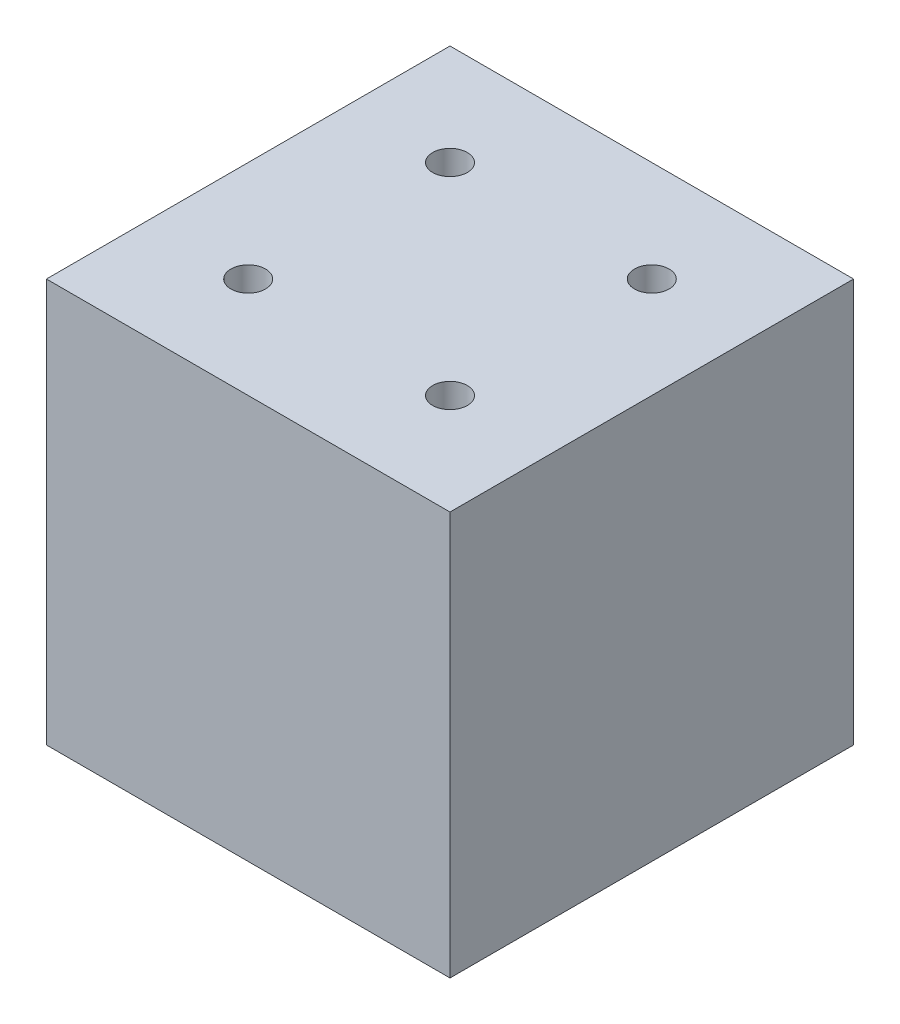
ISO-10303-21;
HEADER;
FILE_DESCRIPTION(('STEP AP214'),'2;1');
FILE_NAME('part.step','',(''),(''),'','','');
FILE_SCHEMA(('AUTOMOTIVE_DESIGN { 1 0 10303 214 1 1 1 1 }'));
ENDSEC;
DATA;
#1=APPLICATION_CONTEXT('core data for automotive mechanical design processes');
#2=APPLICATION_PROTOCOL_DEFINITION('international standard','automotive_design',2000,#1);
#3=PRODUCT_CONTEXT('',#1,'mechanical');
#4=PRODUCT('Part','Part','',(#3));
#5=PRODUCT_RELATED_PRODUCT_CATEGORY('part','',(#4));
#6=PRODUCT_DEFINITION_FORMATION('','',#4);
#7=PRODUCT_DEFINITION_CONTEXT('part definition',#1,'design');
#8=PRODUCT_DEFINITION('design','',#6,#7);
#9=PRODUCT_DEFINITION_SHAPE('','',#8);
#10=(LENGTH_UNIT() NAMED_UNIT(*) SI_UNIT(.MILLI.,.METRE.));
#11=(NAMED_UNIT(*) PLANE_ANGLE_UNIT() SI_UNIT($,.RADIAN.));
#12=(NAMED_UNIT(*) SI_UNIT($,.STERADIAN.) SOLID_ANGLE_UNIT());
#13=UNCERTAINTY_MEASURE_WITH_UNIT(LENGTH_MEASURE(1.E-05),#10,'distance_accuracy_value','');
#14=(GEOMETRIC_REPRESENTATION_CONTEXT(3) GLOBAL_UNCERTAINTY_ASSIGNED_CONTEXT((#13)) GLOBAL_UNIT_ASSIGNED_CONTEXT((#10,
#11,#12)) REPRESENTATION_CONTEXT('',''));
#15=CARTESIAN_POINT('',(0.,0.,0.));
#16=DIRECTION('',(0.,0.,1.));
#17=DIRECTION('',(1.,0.,0.));
#18=AXIS2_PLACEMENT_3D('',#15,#16,#17);
#19=CARTESIAN_POINT('',(25.4,50.8,25.4));
#20=DIRECTION('',(-1.,0.,0.));
#21=DIRECTION('',(0.,0.,1.));
#22=AXIS2_PLACEMENT_3D('',#19,#20,#21);
#23=PLANE('',#22);
#24=DIRECTION('',(0.,0.,-1.));
#25=VECTOR('',#24,1.);
#26=CARTESIAN_POINT('',(25.4,0.,25.4));
#27=LINE('',#26,#25);
#28=CARTESIAN_POINT('',(25.4,0.,25.4));
#29=VERTEX_POINT('',#28);
#30=CARTESIAN_POINT('',(25.4,0.,-25.4));
#31=VERTEX_POINT('',#30);
#32=EDGE_CURVE('E96',#29,#31,#27,.T.);
#33=ORIENTED_EDGE('',*,*,#32,.T.);
#34=DIRECTION('',(0.,-1.,0.));
#35=VECTOR('',#34,1.);
#36=CARTESIAN_POINT('',(25.4,50.8,-25.4));
#37=LINE('',#36,#35);
#38=CARTESIAN_POINT('',(25.4,50.8,-25.4));
#39=VERTEX_POINT('',#38);
#40=EDGE_CURVE('E11',#39,#31,#37,.T.);
#41=ORIENTED_EDGE('',*,*,#40,.F.);
#42=DIRECTION('',(0.,0.,-1.));
#43=VECTOR('',#42,1.);
#44=CARTESIAN_POINT('',(25.4,50.8,25.4));
#45=LINE('',#44,#43);
#46=CARTESIAN_POINT('',(25.4,50.8,25.4));
#47=VERTEX_POINT('',#46);
#48=EDGE_CURVE('E84',#47,#39,#45,.T.);
#49=ORIENTED_EDGE('',*,*,#48,.F.);
#50=DIRECTION('',(0.,-1.,0.));
#51=VECTOR('',#50,1.);
#52=CARTESIAN_POINT('',(25.4,50.8,25.4));
#53=LINE('',#52,#51);
#54=EDGE_CURVE('E92',#47,#29,#53,.T.);
#55=ORIENTED_EDGE('',*,*,#54,.T.);
#56=EDGE_LOOP('',(#33,#41,#49,#55));
#57=FACE_BOUND('',#56,.T.);
#58=ADVANCED_FACE('F33',(#57),#23,.F.);
#59=CARTESIAN_POINT('',(-25.4,50.8,-25.4));
#60=DIRECTION('',(0.,0.,1.));
#61=DIRECTION('',(1.,0.,0.));
#62=AXIS2_PLACEMENT_3D('',#59,#60,#61);
#63=PLANE('',#62);
#64=DIRECTION('',(-1.,0.,0.));
#65=VECTOR('',#64,1.);
#66=CARTESIAN_POINT('',(-25.4,0.,-25.4));
#67=LINE('',#66,#65);
#68=CARTESIAN_POINT('',(-25.4,0.,-25.4));
#69=VERTEX_POINT('',#68);
#70=EDGE_CURVE('E88',#31,#69,#67,.T.);
#71=ORIENTED_EDGE('',*,*,#70,.T.);
#72=DIRECTION('',(0.,-1.,0.));
#73=VECTOR('',#72,1.);
#74=CARTESIAN_POINT('',(-25.4,50.8,-25.4));
#75=LINE('',#74,#73);
#76=CARTESIAN_POINT('',(-25.4,50.8,-25.4));
#77=VERTEX_POINT('',#76);
#78=EDGE_CURVE('E41',#77,#69,#75,.T.);
#79=ORIENTED_EDGE('',*,*,#78,.F.);
#80=DIRECTION('',(-1.,0.,0.));
#81=VECTOR('',#80,1.);
#82=CARTESIAN_POINT('',(-25.4,50.8,-25.4));
#83=LINE('',#82,#81);
#84=EDGE_CURVE('E79',#39,#77,#83,.T.);
#85=ORIENTED_EDGE('',*,*,#84,.F.);
#86=ORIENTED_EDGE('',*,*,#40,.T.);
#87=EDGE_LOOP('',(#71,#79,#85,#86));
#88=FACE_BOUND('',#87,.T.);
#89=ADVANCED_FACE('F87',(#88),#63,.F.);
#90=CARTESIAN_POINT('',(-25.4,50.8,25.4));
#91=DIRECTION('',(1.,0.,0.));
#92=DIRECTION('',(0.,0.,-1.));
#93=AXIS2_PLACEMENT_3D('',#90,#91,#92);
#94=PLANE('',#93);
#95=DIRECTION('',(0.,0.,1.));
#96=VECTOR('',#95,1.);
#97=CARTESIAN_POINT('',(-25.4,0.,25.4));
#98=LINE('',#97,#96);
#99=CARTESIAN_POINT('',(-25.4,0.,25.4));
#100=VERTEX_POINT('',#99);
#101=EDGE_CURVE('E66',#69,#100,#98,.T.);
#102=ORIENTED_EDGE('',*,*,#101,.T.);
#103=DIRECTION('',(0.,-1.,0.));
#104=VECTOR('',#103,1.);
#105=CARTESIAN_POINT('',(-25.4,50.8,25.4));
#106=LINE('',#105,#104);
#107=CARTESIAN_POINT('',(-25.4,50.8,25.4));
#108=VERTEX_POINT('',#107);
#109=EDGE_CURVE('E89',#108,#100,#106,.T.);
#110=ORIENTED_EDGE('',*,*,#109,.F.);
#111=DIRECTION('',(0.,0.,1.));
#112=VECTOR('',#111,1.);
#113=CARTESIAN_POINT('',(-25.4,50.8,25.4));
#114=LINE('',#113,#112);
#115=EDGE_CURVE('E82',#77,#108,#114,.T.);
#116=ORIENTED_EDGE('',*,*,#115,.F.);
#117=ORIENTED_EDGE('',*,*,#78,.T.);
#118=EDGE_LOOP('',(#102,#110,#116,#117));
#119=FACE_BOUND('',#118,.T.);
#120=ADVANCED_FACE('F90',(#119),#94,.F.);
#121=CARTESIAN_POINT('',(-25.4,50.8,25.4));
#122=DIRECTION('',(0.,0.,-1.));
#123=DIRECTION('',(-1.,0.,0.));
#124=AXIS2_PLACEMENT_3D('',#121,#122,#123);
#125=PLANE('',#124);
#126=DIRECTION('',(1.,0.,0.));
#127=VECTOR('',#126,1.);
#128=CARTESIAN_POINT('',(-25.4,0.,25.4));
#129=LINE('',#128,#127);
#130=EDGE_CURVE('E72',#100,#29,#129,.T.);
#131=ORIENTED_EDGE('',*,*,#130,.T.);
#132=ORIENTED_EDGE('',*,*,#54,.F.);
#133=DIRECTION('',(1.,0.,0.));
#134=VECTOR('',#133,1.);
#135=CARTESIAN_POINT('',(-25.4,50.8,25.4));
#136=LINE('',#135,#134);
#137=EDGE_CURVE('E49',#108,#47,#136,.T.);
#138=ORIENTED_EDGE('',*,*,#137,.F.);
#139=ORIENTED_EDGE('',*,*,#109,.T.);
#140=EDGE_LOOP('',(#131,#132,#138,#139));
#141=FACE_BOUND('',#140,.T.);
#142=ADVANCED_FACE('F104',(#141),#125,.F.);
#143=CARTESIAN_POINT('',(0.,50.8,0.));
#144=DIRECTION('',(0.,-1.,0.));
#145=DIRECTION('',(0.,0.,-1.));
#146=AXIS2_PLACEMENT_3D('',#143,#144,#145);
#147=PLANE('',#146);
#148=CARTESIAN_POINT('',(-12.7,50.8,12.7));
#149=DIRECTION('',(0.,1.,0.));
#150=DIRECTION('',(0.,0.,1.));
#151=AXIS2_PLACEMENT_3D('',#148,#149,#150);
#152=CIRCLE('',#151,2.1828125);
#153=CARTESIAN_POINT('',(-12.7,50.8,14.8828125));
#154=VERTEX_POINT('',#153);
#155=EDGE_CURVE('E128',#154,#154,#152,.T.);
#156=ORIENTED_EDGE('',*,*,#155,.F.);
#157=EDGE_LOOP('',(#156));
#158=FACE_BOUND('',#157,.T.);
#159=CARTESIAN_POINT('',(12.7,50.8,12.7));
#160=DIRECTION('',(0.,1.,0.));
#161=DIRECTION('',(0.,0.,1.));
#162=AXIS2_PLACEMENT_3D('',#159,#160,#161);
#163=CIRCLE('',#162,2.1828125);
#164=CARTESIAN_POINT('',(12.7,50.8,14.8828125));
#165=VERTEX_POINT('',#164);
#166=EDGE_CURVE('E122',#165,#165,#163,.T.);
#167=ORIENTED_EDGE('',*,*,#166,.F.);
#168=EDGE_LOOP('',(#167));
#169=FACE_BOUND('',#168,.T.);
#170=CARTESIAN_POINT('',(12.7,50.8,-12.7));
#171=DIRECTION('',(0.,1.,0.));
#172=DIRECTION('',(0.,0.,1.));
#173=AXIS2_PLACEMENT_3D('',#170,#171,#172);
#174=CIRCLE('',#173,2.1828125);
#175=CARTESIAN_POINT('',(12.7,50.8,-10.5171875));
#176=VERTEX_POINT('',#175);
#177=EDGE_CURVE('E116',#176,#176,#174,.T.);
#178=ORIENTED_EDGE('',*,*,#177,.F.);
#179=EDGE_LOOP('',(#178));
#180=FACE_BOUND('',#179,.T.);
#181=CARTESIAN_POINT('',(-12.7,50.8,-12.7));
#182=DIRECTION('',(0.,1.,0.));
#183=DIRECTION('',(0.,0.,1.));
#184=AXIS2_PLACEMENT_3D('',#181,#182,#183);
#185=CIRCLE('',#184,2.1828125);
#186=CARTESIAN_POINT('',(-12.7,50.8,-10.5171875));
#187=VERTEX_POINT('',#186);
#188=EDGE_CURVE('E110',#187,#187,#185,.T.);
#189=ORIENTED_EDGE('',*,*,#188,.F.);
#190=EDGE_LOOP('',(#189));
#191=FACE_BOUND('',#190,.T.);
#192=ORIENTED_EDGE('',*,*,#48,.T.);
#193=ORIENTED_EDGE('',*,*,#84,.T.);
#194=ORIENTED_EDGE('',*,*,#115,.T.);
#195=ORIENTED_EDGE('',*,*,#137,.T.);
#196=EDGE_LOOP('',(#192,#193,#194,#195));
#197=FACE_BOUND('',#196,.T.);
#198=ADVANCED_FACE('F80',(#158,#169,#180,#191,#197),#147,.F.);
#199=CARTESIAN_POINT('',(0.,0.,0.));
#200=DIRECTION('',(0.,-1.,0.));
#201=DIRECTION('',(0.,0.,-1.));
#202=AXIS2_PLACEMENT_3D('',#199,#200,#201);
#203=PLANE('',#202);
#204=ORIENTED_EDGE('',*,*,#32,.F.);
#205=ORIENTED_EDGE('',*,*,#130,.F.);
#206=ORIENTED_EDGE('',*,*,#101,.F.);
#207=ORIENTED_EDGE('',*,*,#70,.F.);
#208=EDGE_LOOP('',(#204,#205,#206,#207));
#209=FACE_BOUND('',#208,.T.);
#210=ADVANCED_FACE('F107',(#209),#203,.T.);
#211=CARTESIAN_POINT('',(-12.7,25.4,-12.7));
#212=DIRECTION('',(0.,1.,0.));
#213=DIRECTION('',(0.,0.,1.));
#214=AXIS2_PLACEMENT_3D('',#211,#212,#213);
#215=CYLINDRICAL_SURFACE('',#214,2.1828125);
#216=CARTESIAN_POINT('',(-12.7,25.4,-12.7));
#217=DIRECTION('',(0.,1.,0.));
#218=DIRECTION('',(0.,0.,1.));
#219=AXIS2_PLACEMENT_3D('',#216,#217,#218);
#220=CIRCLE('',#219,2.1828125);
#221=CARTESIAN_POINT('',(-12.7,25.4,-10.5171875));
#222=VERTEX_POINT('',#221);
#223=EDGE_CURVE('E99',#222,#222,#220,.T.);
#224=ORIENTED_EDGE('',*,*,#223,.F.);
#225=EDGE_LOOP('',(#224));
#226=FACE_BOUND('',#225,.T.);
#227=ORIENTED_EDGE('',*,*,#188,.T.);
#228=EDGE_LOOP('',(#227));
#229=FACE_BOUND('',#228,.T.);
#230=ADVANCED_FACE('F152',(#226,#229),#215,.F.);
#231=CARTESIAN_POINT('',(-12.7,25.4,-12.7));
#232=DIRECTION('',(0.,1.,0.));
#233=DIRECTION('',(0.,0.,1.));
#234=AXIS2_PLACEMENT_3D('',#231,#232,#233);
#235=PLANE('',#234);
#236=ORIENTED_EDGE('',*,*,#223,.T.);
#237=EDGE_LOOP('',(#236));
#238=FACE_BOUND('',#237,.T.);
#239=ADVANCED_FACE('F154',(#238),#235,.T.);
#240=CARTESIAN_POINT('',(12.7,25.4,-12.7));
#241=DIRECTION('',(0.,1.,0.));
#242=DIRECTION('',(0.,0.,1.));
#243=AXIS2_PLACEMENT_3D('',#240,#241,#242);
#244=CYLINDRICAL_SURFACE('',#243,2.1828125);
#245=CARTESIAN_POINT('',(12.7,25.4,-12.7));
#246=DIRECTION('',(0.,1.,0.));
#247=DIRECTION('',(0.,0.,1.));
#248=AXIS2_PLACEMENT_3D('',#245,#246,#247);
#249=CIRCLE('',#248,2.1828125);
#250=CARTESIAN_POINT('',(12.7,25.4,-10.5171875));
#251=VERTEX_POINT('',#250);
#252=EDGE_CURVE('E119',#251,#251,#249,.T.);
#253=ORIENTED_EDGE('',*,*,#252,.F.);
#254=EDGE_LOOP('',(#253));
#255=FACE_BOUND('',#254,.T.);
#256=ORIENTED_EDGE('',*,*,#177,.T.);
#257=EDGE_LOOP('',(#256));
#258=FACE_BOUND('',#257,.T.);
#259=ADVANCED_FACE('F161',(#255,#258),#244,.F.);
#260=CARTESIAN_POINT('',(12.7,25.4,-12.7));
#261=DIRECTION('',(0.,1.,0.));
#262=DIRECTION('',(0.,0.,1.));
#263=AXIS2_PLACEMENT_3D('',#260,#261,#262);
#264=PLANE('',#263);
#265=ORIENTED_EDGE('',*,*,#252,.T.);
#266=EDGE_LOOP('',(#265));
#267=FACE_BOUND('',#266,.T.);
#268=ADVANCED_FACE('F209',(#267),#264,.T.);
#269=CARTESIAN_POINT('',(12.7,25.4,12.7));
#270=DIRECTION('',(0.,1.,0.));
#271=DIRECTION('',(0.,0.,1.));
#272=AXIS2_PLACEMENT_3D('',#269,#270,#271);
#273=CYLINDRICAL_SURFACE('',#272,2.1828125);
#274=CARTESIAN_POINT('',(12.7,25.4,12.7));
#275=DIRECTION('',(0.,1.,0.));
#276=DIRECTION('',(0.,0.,1.));
#277=AXIS2_PLACEMENT_3D('',#274,#275,#276);
#278=CIRCLE('',#277,2.1828125);
#279=CARTESIAN_POINT('',(12.7,25.4,14.8828125));
#280=VERTEX_POINT('',#279);
#281=EDGE_CURVE('E125',#280,#280,#278,.T.);
#282=ORIENTED_EDGE('',*,*,#281,.F.);
#283=EDGE_LOOP('',(#282));
#284=FACE_BOUND('',#283,.T.);
#285=ORIENTED_EDGE('',*,*,#166,.T.);
#286=EDGE_LOOP('',(#285));
#287=FACE_BOUND('',#286,.T.);
#288=ADVANCED_FACE('F218',(#284,#287),#273,.F.);
#289=CARTESIAN_POINT('',(12.7,25.4,12.7));
#290=DIRECTION('',(0.,1.,0.));
#291=DIRECTION('',(0.,0.,1.));
#292=AXIS2_PLACEMENT_3D('',#289,#290,#291);
#293=PLANE('',#292);
#294=ORIENTED_EDGE('',*,*,#281,.T.);
#295=EDGE_LOOP('',(#294));
#296=FACE_BOUND('',#295,.T.);
#297=ADVANCED_FACE('F139',(#296),#293,.T.);
#298=CARTESIAN_POINT('',(-12.7,25.4,12.7));
#299=DIRECTION('',(0.,1.,0.));
#300=DIRECTION('',(0.,0.,1.));
#301=AXIS2_PLACEMENT_3D('',#298,#299,#300);
#302=CYLINDRICAL_SURFACE('',#301,2.1828125);
#303=CARTESIAN_POINT('',(-12.7,25.4,12.7));
#304=DIRECTION('',(0.,1.,0.));
#305=DIRECTION('',(0.,0.,1.));
#306=AXIS2_PLACEMENT_3D('',#303,#304,#305);
#307=CIRCLE('',#306,2.1828125);
#308=CARTESIAN_POINT('',(-12.7,25.4,14.8828125));
#309=VERTEX_POINT('',#308);
#310=EDGE_CURVE('E113',#309,#309,#307,.T.);
#311=ORIENTED_EDGE('',*,*,#310,.F.);
#312=EDGE_LOOP('',(#311));
#313=FACE_BOUND('',#312,.T.);
#314=ORIENTED_EDGE('',*,*,#155,.T.);
#315=EDGE_LOOP('',(#314));
#316=FACE_BOUND('',#315,.T.);
#317=ADVANCED_FACE('F136',(#313,#316),#302,.F.);
#318=CARTESIAN_POINT('',(-12.7,25.4,12.7));
#319=DIRECTION('',(0.,1.,0.));
#320=DIRECTION('',(0.,0.,1.));
#321=AXIS2_PLACEMENT_3D('',#318,#319,#320);
#322=PLANE('',#321);
#323=ORIENTED_EDGE('',*,*,#310,.T.);
#324=EDGE_LOOP('',(#323));
#325=FACE_BOUND('',#324,.T.);
#326=ADVANCED_FACE('F134',(#325),#322,.T.);
#327=CLOSED_SHELL('',(#58,#89,#120,#142,#198,#210,#230,#239,#259,#268,#288,#297,#317,#326));
#328=MANIFOLD_SOLID_BREP('B2',#327);
#329=ADVANCED_BREP_SHAPE_REPRESENTATION('',(#18,#328),#14);
#330=SHAPE_DEFINITION_REPRESENTATION(#9,#329);
ENDSEC;
END-ISO-10303-21;
